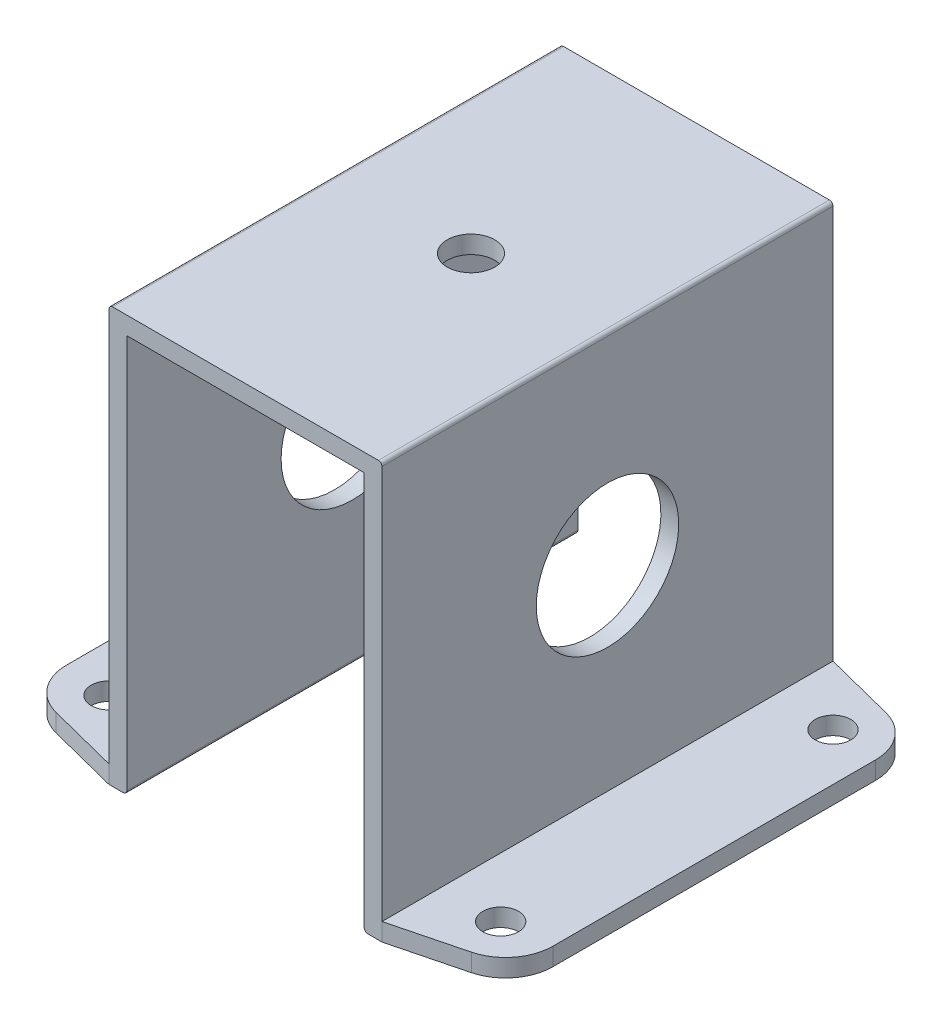
ISO-10303-21;
HEADER;
FILE_DESCRIPTION(('STEP AP214'),'2;1');
FILE_NAME('part.step','',(''),(''),'','','');
FILE_SCHEMA(('AUTOMOTIVE_DESIGN { 1 0 10303 214 1 1 1 1 }'));
ENDSEC;
DATA;
#1=APPLICATION_CONTEXT('core data for automotive mechanical design processes');
#2=APPLICATION_PROTOCOL_DEFINITION('international standard','automotive_design',2000,#1);
#3=PRODUCT_CONTEXT('',#1,'mechanical');
#4=PRODUCT('Part','Part','',(#3));
#5=PRODUCT_RELATED_PRODUCT_CATEGORY('part','',(#4));
#6=PRODUCT_DEFINITION_FORMATION('','',#4);
#7=PRODUCT_DEFINITION_CONTEXT('part definition',#1,'design');
#8=PRODUCT_DEFINITION('design','',#6,#7);
#9=PRODUCT_DEFINITION_SHAPE('','',#8);
#10=(LENGTH_UNIT() NAMED_UNIT(*) SI_UNIT(.MILLI.,.METRE.));
#11=(NAMED_UNIT(*) PLANE_ANGLE_UNIT() SI_UNIT($,.RADIAN.));
#12=(NAMED_UNIT(*) SI_UNIT($,.STERADIAN.) SOLID_ANGLE_UNIT());
#13=UNCERTAINTY_MEASURE_WITH_UNIT(LENGTH_MEASURE(1.E-05),#10,'distance_accuracy_value','');
#14=(GEOMETRIC_REPRESENTATION_CONTEXT(3) GLOBAL_UNCERTAINTY_ASSIGNED_CONTEXT((#13)) GLOBAL_UNIT_ASSIGNED_CONTEXT((#10,
#11,#12)) REPRESENTATION_CONTEXT('',''));
#15=CARTESIAN_POINT('',(0.,0.,0.));
#16=DIRECTION('',(0.,0.,1.));
#17=DIRECTION('',(1.,0.,0.));
#18=AXIS2_PLACEMENT_3D('',#15,#16,#17);
#19=CARTESIAN_POINT('',(-11.5,0.,19.));
#20=DIRECTION('',(0.,1.,0.));
#21=DIRECTION('',(0.,0.,1.));
#22=AXIS2_PLACEMENT_3D('',#19,#20,#21);
#23=PLANE('',#22);
#24=DIRECTION('',(1.,0.,0.));
#25=VECTOR('',#24,1.);
#26=CARTESIAN_POINT('',(-11.5,0.,-19.));
#27=LINE('',#26,#25);
#28=CARTESIAN_POINT('',(-11.5,0.,-19.));
#29=VERTEX_POINT('',#28);
#30=CARTESIAN_POINT('',(-10.3,0.,-19.));
#31=VERTEX_POINT('',#30);
#32=EDGE_CURVE('E316',#29,#31,#27,.T.);
#33=ORIENTED_EDGE('',*,*,#32,.T.);
#34=DIRECTION('',(0.,0.,-1.));
#35=VECTOR('',#34,1.);
#36=CARTESIAN_POINT('',(-10.3,0.,19.));
#37=LINE('',#36,#35);
#38=CARTESIAN_POINT('',(-10.3,0.,19.));
#39=VERTEX_POINT('',#38);
#40=EDGE_CURVE('E369',#31,#39,#37,.F.);
#41=ORIENTED_EDGE('',*,*,#40,.T.);
#42=DIRECTION('',(1.,0.,0.));
#43=VECTOR('',#42,1.);
#44=CARTESIAN_POINT('',(-11.5,0.,19.));
#45=LINE('',#44,#43);
#46=CARTESIAN_POINT('',(-11.5,0.,19.));
#47=VERTEX_POINT('',#46);
#48=EDGE_CURVE('E319',#47,#39,#45,.T.);
#49=ORIENTED_EDGE('',*,*,#48,.F.);
#50=DIRECTION('',(0.968862785912226,0.,0.247598267510903));
#51=VECTOR('',#50,1.);
#52=CARTESIAN_POINT('',(-5.26289257156102,0.,20.5939274539344));
#53=LINE('',#52,#51);
#54=CARTESIAN_POINT('',(-17.4903930700436,0.,17.4691217709889));
#55=VERTEX_POINT('',#54);
#56=EDGE_CURVE('E287',#55,#47,#53,.T.);
#57=ORIENTED_EDGE('',*,*,#56,.F.);
#58=CARTESIAN_POINT('',(-16.5,0.,13.59367062734));
#59=DIRECTION('',(0.,1.,0.));
#60=DIRECTION('',(0.,0.,1.));
#61=AXIS2_PLACEMENT_3D('',#58,#59,#60);
#62=CIRCLE('',#61,4.);
#63=CARTESIAN_POINT('',(-20.5,0.,13.59367062734));
#64=VERTEX_POINT('',#63);
#65=EDGE_CURVE('E284',#55,#64,#62,.F.);
#66=ORIENTED_EDGE('',*,*,#65,.T.);
#67=DIRECTION('',(0.,0.,1.));
#68=VECTOR('',#67,1.);
#69=CARTESIAN_POINT('',(-20.5,0.,0.));
#70=LINE('',#69,#68);
#71=CARTESIAN_POINT('',(-20.5,0.,-13.5936706273399));
#72=VERTEX_POINT('',#71);
#73=EDGE_CURVE('E260',#72,#64,#70,.T.);
#74=ORIENTED_EDGE('',*,*,#73,.F.);
#75=CARTESIAN_POINT('',(-16.5,0.,-13.59367062734));
#76=DIRECTION('',(0.,1.,0.));
#77=DIRECTION('',(0.,0.,1.));
#78=AXIS2_PLACEMENT_3D('',#75,#76,#77);
#79=CIRCLE('',#78,4.);
#80=CARTESIAN_POINT('',(-17.4903930700436,0.,-17.4691217709889));
#81=VERTEX_POINT('',#80);
#82=EDGE_CURVE('E293',#81,#72,#79,.T.);
#83=ORIENTED_EDGE('',*,*,#82,.F.);
#84=DIRECTION('',(-0.968862785912226,0.,0.247598267510902));
#85=VECTOR('',#84,1.);
#86=CARTESIAN_POINT('',(-5.26289257156102,0.,-20.5939274539344));
#87=LINE('',#86,#85);
#88=EDGE_CURVE('E290',#29,#81,#87,.T.);
#89=ORIENTED_EDGE('',*,*,#88,.F.);
#90=EDGE_LOOP('',(#33,#41,#49,#57,#66,#74,#83,#89));
#91=FACE_BOUND('',#90,.T.);
#92=CARTESIAN_POINT('',(-16.5,0.,14.));
#93=DIRECTION('',(0.,1.,0.));
#94=DIRECTION('',(0.,0.,1.));
#95=AXIS2_PLACEMENT_3D('',#92,#93,#94);
#96=CIRCLE('',#95,1.5);
#97=CARTESIAN_POINT('',(-16.5,0.,15.5));
#98=VERTEX_POINT('',#97);
#99=EDGE_CURVE('E201',#98,#98,#96,.T.);
#100=ORIENTED_EDGE('',*,*,#99,.T.);
#101=EDGE_LOOP('',(#100));
#102=FACE_BOUND('',#101,.T.);
#103=CARTESIAN_POINT('',(-16.5,0.,-14.));
#104=DIRECTION('',(0.,1.,0.));
#105=DIRECTION('',(0.,0.,1.));
#106=AXIS2_PLACEMENT_3D('',#103,#104,#105);
#107=CIRCLE('',#106,1.5);
#108=CARTESIAN_POINT('',(-16.5,0.,-12.5));
#109=VERTEX_POINT('',#108);
#110=EDGE_CURVE('E281',#109,#109,#107,.T.);
#111=ORIENTED_EDGE('',*,*,#110,.T.);
#112=EDGE_LOOP('',(#111));
#113=FACE_BOUND('',#112,.T.);
#114=ADVANCED_FACE('F37',(#91,#102,#113),#23,.F.);
#115=CARTESIAN_POINT('',(-10.,0.,19.));
#116=DIRECTION('',(-1.,0.,0.));
#117=DIRECTION('',(0.,0.,1.));
#118=AXIS2_PLACEMENT_3D('',#115,#116,#117);
#119=PLANE('',#118);
#120=CARTESIAN_POINT('',(-10.,18.,0.));
#121=DIRECTION('',(-1.,0.,0.));
#122=DIRECTION('',(0.,0.,1.));
#123=AXIS2_PLACEMENT_3D('',#120,#121,#122);
#124=CIRCLE('',#123,6.);
#125=CARTESIAN_POINT('',(-10.,18.,6.));
#126=VERTEX_POINT('',#125);
#127=EDGE_CURVE('E237',#126,#126,#124,.T.);
#128=ORIENTED_EDGE('',*,*,#127,.T.);
#129=EDGE_LOOP('',(#128));
#130=FACE_BOUND('',#129,.T.);
#131=DIRECTION('',(0.,1.,0.));
#132=VECTOR('',#131,1.);
#133=CARTESIAN_POINT('',(-10.,0.,19.));
#134=LINE('',#133,#132);
#135=CARTESIAN_POINT('',(-10.,0.3,19.));
#136=VERTEX_POINT('',#135);
#137=CARTESIAN_POINT('',(-10.,33.5,19.));
#138=VERTEX_POINT('',#137);
#139=EDGE_CURVE('E322',#136,#138,#134,.T.);
#140=ORIENTED_EDGE('',*,*,#139,.F.);
#141=DIRECTION('',(0.,0.,-1.));
#142=VECTOR('',#141,1.);
#143=CARTESIAN_POINT('',(-10.,0.3,19.));
#144=LINE('',#143,#142);
#145=CARTESIAN_POINT('',(-10.,0.3,-19.));
#146=VERTEX_POINT('',#145);
#147=EDGE_CURVE('E364',#136,#146,#144,.T.);
#148=ORIENTED_EDGE('',*,*,#147,.T.);
#149=DIRECTION('',(0.,1.,0.));
#150=VECTOR('',#149,1.);
#151=CARTESIAN_POINT('',(-10.,0.,-19.));
#152=LINE('',#151,#150);
#153=CARTESIAN_POINT('',(-10.,33.5,-19.));
#154=VERTEX_POINT('',#153);
#155=EDGE_CURVE('E342',#146,#154,#152,.T.);
#156=ORIENTED_EDGE('',*,*,#155,.T.);
#157=DIRECTION('',(0.,0.,-1.));
#158=VECTOR('',#157,1.);
#159=CARTESIAN_POINT('',(-10.,33.5,19.));
#160=LINE('',#159,#158);
#161=EDGE_CURVE('E361',#138,#154,#160,.T.);
#162=ORIENTED_EDGE('',*,*,#161,.F.);
#163=EDGE_LOOP('',(#140,#148,#156,#162));
#164=FACE_BOUND('',#163,.T.);
#165=ADVANCED_FACE('F440',(#130,#164),#119,.F.);
#166=CARTESIAN_POINT('',(-10.,33.5,19.));
#167=DIRECTION('',(0.,1.,0.));
#168=DIRECTION('',(0.,0.,1.));
#169=AXIS2_PLACEMENT_3D('',#166,#167,#168);
#170=PLANE('',#169);
#171=CARTESIAN_POINT('',(0.,33.5,0.));
#172=DIRECTION('',(0.,1.,0.));
#173=DIRECTION('',(0.,0.,1.));
#174=AXIS2_PLACEMENT_3D('',#171,#172,#173);
#175=CIRCLE('',#174,2.);
#176=CARTESIAN_POINT('',(0.,33.5,2.));
#177=VERTEX_POINT('',#176);
#178=EDGE_CURVE('E313',#177,#177,#175,.T.);
#179=ORIENTED_EDGE('',*,*,#178,.T.);
#180=EDGE_LOOP('',(#179));
#181=FACE_BOUND('',#180,.T.);
#182=DIRECTION('',(1.,0.,0.));
#183=VECTOR('',#182,1.);
#184=CARTESIAN_POINT('',(-10.,33.5,-19.));
#185=LINE('',#184,#183);
#186=CARTESIAN_POINT('',(10.,33.5,-19.));
#187=VERTEX_POINT('',#186);
#188=EDGE_CURVE('E344',#154,#187,#185,.T.);
#189=ORIENTED_EDGE('',*,*,#188,.T.);
#190=DIRECTION('',(0.,0.,-1.));
#191=VECTOR('',#190,1.);
#192=CARTESIAN_POINT('',(10.,33.5,19.));
#193=LINE('',#192,#191);
#194=CARTESIAN_POINT('',(10.,33.5,19.));
#195=VERTEX_POINT('',#194);
#196=EDGE_CURVE('E339',#195,#187,#193,.T.);
#197=ORIENTED_EDGE('',*,*,#196,.F.);
#198=DIRECTION('',(1.,0.,0.));
#199=VECTOR('',#198,1.);
#200=CARTESIAN_POINT('',(-10.,33.5,19.));
#201=LINE('',#200,#199);
#202=EDGE_CURVE('E325',#138,#195,#201,.T.);
#203=ORIENTED_EDGE('',*,*,#202,.F.);
#204=ORIENTED_EDGE('',*,*,#161,.T.);
#205=EDGE_LOOP('',(#189,#197,#203,#204));
#206=FACE_BOUND('',#205,.T.);
#207=ADVANCED_FACE('F446',(#181,#206),#170,.F.);
#208=CARTESIAN_POINT('',(10.,33.5,19.));
#209=DIRECTION('',(1.,0.,0.));
#210=DIRECTION('',(0.,1.,0.));
#211=AXIS2_PLACEMENT_3D('',#208,#209,#210);
#212=PLANE('',#211);
#213=CARTESIAN_POINT('',(10.,18.,0.));
#214=DIRECTION('',(1.,0.,0.));
#215=DIRECTION('',(0.,1.,0.));
#216=AXIS2_PLACEMENT_3D('',#213,#214,#215);
#217=CIRCLE('',#216,6.);
#218=CARTESIAN_POINT('',(10.,24.,0.));
#219=VERTEX_POINT('',#218);
#220=EDGE_CURVE('E754',#219,#219,#217,.T.);
#221=ORIENTED_EDGE('',*,*,#220,.T.);
#222=EDGE_LOOP('',(#221));
#223=FACE_BOUND('',#222,.T.);
#224=DIRECTION('',(0.,-1.,0.));
#225=VECTOR('',#224,1.);
#226=CARTESIAN_POINT('',(10.,33.5,-19.));
#227=LINE('',#226,#225);
#228=CARTESIAN_POINT('',(10.,0.300000000000002,-19.));
#229=VERTEX_POINT('',#228);
#230=EDGE_CURVE('E346',#187,#229,#227,.T.);
#231=ORIENTED_EDGE('',*,*,#230,.T.);
#232=DIRECTION('',(0.,0.,-1.));
#233=VECTOR('',#232,1.);
#234=CARTESIAN_POINT('',(10.,0.300000000000002,19.));
#235=LINE('',#234,#233);
#236=CARTESIAN_POINT('',(10.,0.300000000000002,19.));
#237=VERTEX_POINT('',#236);
#238=EDGE_CURVE('E378',#229,#237,#235,.F.);
#239=ORIENTED_EDGE('',*,*,#238,.T.);
#240=DIRECTION('',(0.,-1.,0.));
#241=VECTOR('',#240,1.);
#242=CARTESIAN_POINT('',(10.,33.5,19.));
#243=LINE('',#242,#241);
#244=EDGE_CURVE('E327',#195,#237,#243,.T.);
#245=ORIENTED_EDGE('',*,*,#244,.F.);
#246=ORIENTED_EDGE('',*,*,#196,.T.);
#247=EDGE_LOOP('',(#231,#239,#245,#246));
#248=FACE_BOUND('',#247,.T.);
#249=ADVANCED_FACE('F539',(#223,#248),#212,.F.);
#250=CARTESIAN_POINT('',(10.,0.,19.));
#251=DIRECTION('',(0.,1.,0.));
#252=DIRECTION('',(0.,0.,1.));
#253=AXIS2_PLACEMENT_3D('',#250,#251,#252);
#254=PLANE('',#253);
#255=DIRECTION('',(1.,0.,0.));
#256=VECTOR('',#255,1.);
#257=CARTESIAN_POINT('',(10.,0.,19.));
#258=LINE('',#257,#256);
#259=CARTESIAN_POINT('',(10.3,0.,19.));
#260=VERTEX_POINT('',#259);
#261=CARTESIAN_POINT('',(11.5,0.,19.));
#262=VERTEX_POINT('',#261);
#263=EDGE_CURVE('E330',#260,#262,#258,.T.);
#264=ORIENTED_EDGE('',*,*,#263,.F.);
#265=DIRECTION('',(0.,0.,-1.));
#266=VECTOR('',#265,1.);
#267=CARTESIAN_POINT('',(10.3,0.,19.));
#268=LINE('',#267,#266);
#269=CARTESIAN_POINT('',(10.3,0.,-19.));
#270=VERTEX_POINT('',#269);
#271=EDGE_CURVE('E373',#260,#270,#268,.T.);
#272=ORIENTED_EDGE('',*,*,#271,.T.);
#273=DIRECTION('',(1.,0.,0.));
#274=VECTOR('',#273,1.);
#275=CARTESIAN_POINT('',(10.,0.,-19.));
#276=LINE('',#275,#274);
#277=CARTESIAN_POINT('',(11.5,0.,-19.));
#278=VERTEX_POINT('',#277);
#279=EDGE_CURVE('E349',#270,#278,#276,.T.);
#280=ORIENTED_EDGE('',*,*,#279,.T.);
#281=DIRECTION('',(0.968862785912226,0.,0.247598267510902));
#282=VECTOR('',#281,1.);
#283=CARTESIAN_POINT('',(5.26289257156102,0.,-20.5939274539344));
#284=LINE('',#283,#282);
#285=CARTESIAN_POINT('',(17.4903930700436,0.,-17.4691217709889));
#286=VERTEX_POINT('',#285);
#287=EDGE_CURVE('E247',#278,#286,#284,.T.);
#288=ORIENTED_EDGE('',*,*,#287,.T.);
#289=CARTESIAN_POINT('',(16.5,0.,-13.5936706273399));
#290=DIRECTION('',(0.,1.,0.));
#291=DIRECTION('',(0.,0.,1.));
#292=AXIS2_PLACEMENT_3D('',#289,#290,#291);
#293=CIRCLE('',#292,4.);
#294=CARTESIAN_POINT('',(20.5,0.,-13.5936706273399));
#295=VERTEX_POINT('',#294);
#296=EDGE_CURVE('E244',#295,#286,#293,.T.);
#297=ORIENTED_EDGE('',*,*,#296,.F.);
#298=DIRECTION('',(0.,0.,1.));
#299=VECTOR('',#298,1.);
#300=CARTESIAN_POINT('',(20.5,0.,0.));
#301=LINE('',#300,#299);
#302=CARTESIAN_POINT('',(20.5,0.,13.5936706273399));
#303=VERTEX_POINT('',#302);
#304=EDGE_CURVE('E241',#295,#303,#301,.T.);
#305=ORIENTED_EDGE('',*,*,#304,.T.);
#306=CARTESIAN_POINT('',(16.5,0.,13.59367062734));
#307=DIRECTION('',(0.,1.,0.));
#308=DIRECTION('',(0.,0.,1.));
#309=AXIS2_PLACEMENT_3D('',#306,#307,#308);
#310=CIRCLE('',#309,4.);
#311=CARTESIAN_POINT('',(17.4903930700436,0.,17.4691217709889));
#312=VERTEX_POINT('',#311);
#313=EDGE_CURVE('E239',#312,#303,#310,.T.);
#314=ORIENTED_EDGE('',*,*,#313,.F.);
#315=DIRECTION('',(-0.968862785912226,0.,0.247598267510902));
#316=VECTOR('',#315,1.);
#317=CARTESIAN_POINT('',(5.26289257156102,0.,20.5939274539344));
#318=LINE('',#317,#316);
#319=EDGE_CURVE('E197',#312,#262,#318,.T.);
#320=ORIENTED_EDGE('',*,*,#319,.T.);
#321=EDGE_LOOP('',(#264,#272,#280,#288,#297,#305,#314,#320));
#322=FACE_BOUND('',#321,.T.);
#323=CARTESIAN_POINT('',(16.5,0.,14.));
#324=DIRECTION('',(0.,1.,0.));
#325=DIRECTION('',(0.,0.,1.));
#326=AXIS2_PLACEMENT_3D('',#323,#324,#325);
#327=CIRCLE('',#326,1.5);
#328=CARTESIAN_POINT('',(16.5,0.,15.5));
#329=VERTEX_POINT('',#328);
#330=EDGE_CURVE('E234',#329,#329,#327,.F.);
#331=ORIENTED_EDGE('',*,*,#330,.F.);
#332=EDGE_LOOP('',(#331));
#333=FACE_BOUND('',#332,.T.);
#334=CARTESIAN_POINT('',(16.5,0.,-14.));
#335=DIRECTION('',(0.,1.,0.));
#336=DIRECTION('',(0.,0.,1.));
#337=AXIS2_PLACEMENT_3D('',#334,#335,#336);
#338=CIRCLE('',#337,1.5);
#339=CARTESIAN_POINT('',(16.5,0.,-12.5));
#340=VERTEX_POINT('',#339);
#341=EDGE_CURVE('E219',#340,#340,#338,.F.);
#342=ORIENTED_EDGE('',*,*,#341,.F.);
#343=EDGE_LOOP('',(#342));
#344=FACE_BOUND('',#343,.T.);
#345=ADVANCED_FACE('F457',(#322,#333,#344),#254,.F.);
#346=CARTESIAN_POINT('',(11.5,0.,19.));
#347=DIRECTION('',(-1.,0.,0.));
#348=DIRECTION('',(0.,0.,1.));
#349=AXIS2_PLACEMENT_3D('',#346,#347,#348);
#350=PLANE('',#349);
#351=CARTESIAN_POINT('',(11.5,18.,0.));
#352=DIRECTION('',(-1.,0.,0.));
#353=DIRECTION('',(0.,0.,1.));
#354=AXIS2_PLACEMENT_3D('',#351,#352,#353);
#355=CIRCLE('',#354,6.);
#356=CARTESIAN_POINT('',(11.5,18.,6.));
#357=VERTEX_POINT('',#356);
#358=EDGE_CURVE('E751',#357,#357,#355,.T.);
#359=ORIENTED_EDGE('',*,*,#358,.T.);
#360=EDGE_LOOP('',(#359));
#361=FACE_BOUND('',#360,.T.);
#362=DIRECTION('',(0.,1.,0.));
#363=VECTOR('',#362,1.);
#364=CARTESIAN_POINT('',(11.5,0.,19.));
#365=LINE('',#364,#363);
#366=CARTESIAN_POINT('',(11.5,1.5,19.));
#367=VERTEX_POINT('',#366);
#368=CARTESIAN_POINT('',(11.5,34.7,19.));
#369=VERTEX_POINT('',#368);
#370=EDGE_CURVE('E52',#367,#369,#365,.T.);
#371=ORIENTED_EDGE('',*,*,#370,.F.);
#372=DIRECTION('',(0.,0.,-1.));
#373=VECTOR('',#372,1.);
#374=CARTESIAN_POINT('',(11.5,1.5,0.));
#375=LINE('',#374,#373);
#376=CARTESIAN_POINT('',(11.5,1.5,-19.));
#377=VERTEX_POINT('',#376);
#378=EDGE_CURVE('E215',#367,#377,#375,.T.);
#379=ORIENTED_EDGE('',*,*,#378,.T.);
#380=DIRECTION('',(0.,1.,0.));
#381=VECTOR('',#380,1.);
#382=CARTESIAN_POINT('',(11.5,0.,-19.));
#383=LINE('',#382,#381);
#384=CARTESIAN_POINT('',(11.5,34.7,-19.));
#385=VERTEX_POINT('',#384);
#386=EDGE_CURVE('E351',#377,#385,#383,.T.);
#387=ORIENTED_EDGE('',*,*,#386,.T.);
#388=DIRECTION('',(0.,0.,-1.));
#389=VECTOR('',#388,1.);
#390=CARTESIAN_POINT('',(11.5,34.7,19.));
#391=LINE('',#390,#389);
#392=EDGE_CURVE('E392',#385,#369,#391,.F.);
#393=ORIENTED_EDGE('',*,*,#392,.T.);
#394=EDGE_LOOP('',(#371,#379,#387,#393));
#395=FACE_BOUND('',#394,.T.);
#396=ADVANCED_FACE('F532',(#361,#395),#350,.F.);
#397=CARTESIAN_POINT('',(11.5,35.,19.));
#398=DIRECTION('',(0.,-1.,0.));
#399=DIRECTION('',(0.,0.,-1.));
#400=AXIS2_PLACEMENT_3D('',#397,#398,#399);
#401=PLANE('',#400);
#402=CARTESIAN_POINT('',(0.,35.,0.));
#403=DIRECTION('',(0.,1.,0.));
#404=DIRECTION('',(0.,0.,1.));
#405=AXIS2_PLACEMENT_3D('',#402,#403,#404);
#406=CIRCLE('',#405,2.);
#407=CARTESIAN_POINT('',(0.,35.,2.));
#408=VERTEX_POINT('',#407);
#409=EDGE_CURVE('E312',#408,#408,#406,.T.);
#410=ORIENTED_EDGE('',*,*,#409,.F.);
#411=EDGE_LOOP('',(#410));
#412=FACE_BOUND('',#411,.T.);
#413=DIRECTION('',(-1.,0.,0.));
#414=VECTOR('',#413,1.);
#415=CARTESIAN_POINT('',(11.5,35.,19.));
#416=LINE('',#415,#414);
#417=CARTESIAN_POINT('',(11.2,35.,19.));
#418=VERTEX_POINT('',#417);
#419=CARTESIAN_POINT('',(-11.2,35.,19.));
#420=VERTEX_POINT('',#419);
#421=EDGE_CURVE('E334',#418,#420,#416,.T.);
#422=ORIENTED_EDGE('',*,*,#421,.F.);
#423=DIRECTION('',(0.,0.,-1.));
#424=VECTOR('',#423,1.);
#425=CARTESIAN_POINT('',(11.2,35.,19.));
#426=LINE('',#425,#424);
#427=CARTESIAN_POINT('',(11.2,35.,-19.));
#428=VERTEX_POINT('',#427);
#429=EDGE_CURVE('E384',#418,#428,#426,.T.);
#430=ORIENTED_EDGE('',*,*,#429,.T.);
#431=DIRECTION('',(-1.,0.,0.));
#432=VECTOR('',#431,1.);
#433=CARTESIAN_POINT('',(11.5,35.,-19.));
#434=LINE('',#433,#432);
#435=CARTESIAN_POINT('',(-11.2,35.,-19.));
#436=VERTEX_POINT('',#435);
#437=EDGE_CURVE('E355',#428,#436,#434,.T.);
#438=ORIENTED_EDGE('',*,*,#437,.T.);
#439=DIRECTION('',(0.,0.,-1.));
#440=VECTOR('',#439,1.);
#441=CARTESIAN_POINT('',(-11.2,35.,19.));
#442=LINE('',#441,#440);
#443=EDGE_CURVE('E382',#436,#420,#442,.F.);
#444=ORIENTED_EDGE('',*,*,#443,.T.);
#445=EDGE_LOOP('',(#422,#430,#438,#444));
#446=FACE_BOUND('',#445,.T.);
#447=ADVANCED_FACE('F404',(#412,#446),#401,.F.);
#448=CARTESIAN_POINT('',(-11.5,35.,19.));
#449=DIRECTION('',(1.,0.,0.));
#450=DIRECTION('',(0.,1.,0.));
#451=AXIS2_PLACEMENT_3D('',#448,#449,#450);
#452=PLANE('',#451);
#453=CARTESIAN_POINT('',(-11.5,18.,0.));
#454=DIRECTION('',(-1.,0.,0.));
#455=DIRECTION('',(0.,-1.,0.));
#456=AXIS2_PLACEMENT_3D('',#453,#454,#455);
#457=CIRCLE('',#456,6.);
#458=CARTESIAN_POINT('',(-11.5,12.,0.));
#459=VERTEX_POINT('',#458);
#460=EDGE_CURVE('E757',#459,#459,#457,.T.);
#461=ORIENTED_EDGE('',*,*,#460,.F.);
#462=EDGE_LOOP('',(#461));
#463=FACE_BOUND('',#462,.T.);
#464=DIRECTION('',(0.,-1.,0.));
#465=VECTOR('',#464,1.);
#466=CARTESIAN_POINT('',(-11.5,35.,-19.));
#467=LINE('',#466,#465);
#468=CARTESIAN_POINT('',(-11.5,34.7,-19.));
#469=VERTEX_POINT('',#468);
#470=CARTESIAN_POINT('',(-11.5,1.5,-19.));
#471=VERTEX_POINT('',#470);
#472=EDGE_CURVE('E323',#469,#471,#467,.T.);
#473=ORIENTED_EDGE('',*,*,#472,.T.);
#474=DIRECTION('',(0.,0.,-1.));
#475=VECTOR('',#474,1.);
#476=CARTESIAN_POINT('',(-11.5,1.5,0.));
#477=LINE('',#476,#475);
#478=CARTESIAN_POINT('',(-11.5,1.5,19.));
#479=VERTEX_POINT('',#478);
#480=EDGE_CURVE('E60',#479,#471,#477,.T.);
#481=ORIENTED_EDGE('',*,*,#480,.F.);
#482=DIRECTION('',(0.,-1.,0.));
#483=VECTOR('',#482,1.);
#484=CARTESIAN_POINT('',(-11.5,35.,19.));
#485=LINE('',#484,#483);
#486=CARTESIAN_POINT('',(-11.5,34.7,19.));
#487=VERTEX_POINT('',#486);
#488=EDGE_CURVE('E337',#487,#479,#485,.T.);
#489=ORIENTED_EDGE('',*,*,#488,.F.);
#490=DIRECTION('',(0.,0.,-1.));
#491=VECTOR('',#490,1.);
#492=CARTESIAN_POINT('',(-11.5,34.7,19.));
#493=LINE('',#492,#491);
#494=EDGE_CURVE('E11',#487,#469,#493,.T.);
#495=ORIENTED_EDGE('',*,*,#494,.T.);
#496=EDGE_LOOP('',(#473,#481,#489,#495));
#497=FACE_BOUND('',#496,.T.);
#498=ADVANCED_FACE('F414',(#463,#497),#452,.F.);
#499=CARTESIAN_POINT('',(0.,0.,19.));
#500=DIRECTION('',(0.,0.,1.));
#501=DIRECTION('',(1.,0.,0.));
#502=AXIS2_PLACEMENT_3D('',#499,#500,#501);
#503=PLANE('',#502);
#504=EDGE_CURVE('E332',#262,#367,#365,.T.);
#505=ORIENTED_EDGE('',*,*,#504,.T.);
#506=ORIENTED_EDGE('',*,*,#370,.T.);
#507=CARTESIAN_POINT('',(11.2,34.7,19.));
#508=DIRECTION('',(0.,0.,1.));
#509=DIRECTION('',(1.,0.,0.));
#510=AXIS2_PLACEMENT_3D('',#507,#508,#509);
#511=CIRCLE('',#510,0.3);
#512=EDGE_CURVE('E45',#369,#418,#511,.T.);
#513=ORIENTED_EDGE('',*,*,#512,.T.);
#514=ORIENTED_EDGE('',*,*,#421,.T.);
#515=CARTESIAN_POINT('',(-11.2,34.7,19.));
#516=DIRECTION('',(0.,0.,1.));
#517=DIRECTION('',(1.,0.,0.));
#518=AXIS2_PLACEMENT_3D('',#515,#516,#517);
#519=CIRCLE('',#518,0.3);
#520=EDGE_CURVE('E394',#420,#487,#519,.T.);
#521=ORIENTED_EDGE('',*,*,#520,.T.);
#522=ORIENTED_EDGE('',*,*,#488,.T.);
#523=DIRECTION('',(0.,-1.,0.));
#524=VECTOR('',#523,1.);
#525=CARTESIAN_POINT('',(-11.5,1.5,19.));
#526=LINE('',#525,#524);
#527=EDGE_CURVE('E308',#479,#47,#526,.T.);
#528=ORIENTED_EDGE('',*,*,#527,.T.);
#529=ORIENTED_EDGE('',*,*,#48,.T.);
#530=CARTESIAN_POINT('',(-10.3,0.3,19.));
#531=DIRECTION('',(0.,0.,1.));
#532=DIRECTION('',(1.,0.,0.));
#533=AXIS2_PLACEMENT_3D('',#530,#531,#532);
#534=CIRCLE('',#533,0.3);
#535=EDGE_CURVE('E371',#39,#136,#534,.T.);
#536=ORIENTED_EDGE('',*,*,#535,.T.);
#537=ORIENTED_EDGE('',*,*,#139,.T.);
#538=ORIENTED_EDGE('',*,*,#202,.T.);
#539=ORIENTED_EDGE('',*,*,#244,.T.);
#540=CARTESIAN_POINT('',(10.3,0.3,19.));
#541=DIRECTION('',(0.,0.,1.));
#542=DIRECTION('',(1.,0.,0.));
#543=AXIS2_PLACEMENT_3D('',#540,#541,#542);
#544=CIRCLE('',#543,0.3);
#545=EDGE_CURVE('E380',#237,#260,#544,.T.);
#546=ORIENTED_EDGE('',*,*,#545,.T.);
#547=ORIENTED_EDGE('',*,*,#263,.T.);
#548=EDGE_LOOP('',(#505,#506,#513,#514,#521,#522,#528,#529,#536,#537,#538,#539,#546,#547));
#549=FACE_BOUND('',#548,.T.);
#550=ADVANCED_FACE('F398',(#549),#503,.T.);
#551=CARTESIAN_POINT('',(0.,0.,-19.));
#552=DIRECTION('',(0.,0.,1.));
#553=DIRECTION('',(1.,0.,0.));
#554=AXIS2_PLACEMENT_3D('',#551,#552,#553);
#555=PLANE('',#554);
#556=ORIENTED_EDGE('',*,*,#437,.F.);
#557=CARTESIAN_POINT('',(11.2,34.7,-19.));
#558=DIRECTION('',(0.,0.,1.));
#559=DIRECTION('',(1.,0.,0.));
#560=AXIS2_PLACEMENT_3D('',#557,#558,#559);
#561=CIRCLE('',#560,0.3);
#562=EDGE_CURVE('E389',#428,#385,#561,.F.);
#563=ORIENTED_EDGE('',*,*,#562,.T.);
#564=ORIENTED_EDGE('',*,*,#386,.F.);
#565=EDGE_CURVE('E352',#278,#377,#383,.T.);
#566=ORIENTED_EDGE('',*,*,#565,.F.);
#567=ORIENTED_EDGE('',*,*,#279,.F.);
#568=CARTESIAN_POINT('',(10.3,0.3,-19.));
#569=DIRECTION('',(0.,0.,1.));
#570=DIRECTION('',(1.,0.,0.));
#571=AXIS2_PLACEMENT_3D('',#568,#569,#570);
#572=CIRCLE('',#571,0.3);
#573=EDGE_CURVE('E376',#270,#229,#572,.F.);
#574=ORIENTED_EDGE('',*,*,#573,.T.);
#575=ORIENTED_EDGE('',*,*,#230,.F.);
#576=ORIENTED_EDGE('',*,*,#188,.F.);
#577=ORIENTED_EDGE('',*,*,#155,.F.);
#578=CARTESIAN_POINT('',(-10.3,0.3,-19.));
#579=DIRECTION('',(0.,0.,1.));
#580=DIRECTION('',(1.,0.,0.));
#581=AXIS2_PLACEMENT_3D('',#578,#579,#580);
#582=CIRCLE('',#581,0.3);
#583=EDGE_CURVE('E367',#146,#31,#582,.F.);
#584=ORIENTED_EDGE('',*,*,#583,.T.);
#585=ORIENTED_EDGE('',*,*,#32,.F.);
#586=DIRECTION('',(0.,-1.,0.));
#587=VECTOR('',#586,1.);
#588=CARTESIAN_POINT('',(-11.5,1.5,-19.));
#589=LINE('',#588,#587);
#590=EDGE_CURVE('E305',#471,#29,#589,.T.);
#591=ORIENTED_EDGE('',*,*,#590,.F.);
#592=ORIENTED_EDGE('',*,*,#472,.F.);
#593=CARTESIAN_POINT('',(-11.2,34.7,-19.));
#594=DIRECTION('',(0.,0.,1.));
#595=DIRECTION('',(1.,0.,0.));
#596=AXIS2_PLACEMENT_3D('',#593,#594,#595);
#597=CIRCLE('',#596,0.3);
#598=EDGE_CURVE('E387',#469,#436,#597,.F.);
#599=ORIENTED_EDGE('',*,*,#598,.T.);
#600=EDGE_LOOP('',(#556,#563,#564,#566,#567,#574,#575,#576,#577,#584,#585,#591,#592,#599));
#601=FACE_BOUND('',#600,.T.);
#602=ADVANCED_FACE('F409',(#601),#555,.F.);
#603=CARTESIAN_POINT('',(0.,33.5,0.));
#604=DIRECTION('',(0.,1.,0.));
#605=DIRECTION('',(0.,0.,1.));
#606=AXIS2_PLACEMENT_3D('',#603,#604,#605);
#607=CYLINDRICAL_SURFACE('',#606,2.);
#608=ORIENTED_EDGE('',*,*,#178,.F.);
#609=EDGE_LOOP('',(#608));
#610=FACE_BOUND('',#609,.T.);
#611=ORIENTED_EDGE('',*,*,#409,.T.);
#612=EDGE_LOOP('',(#611));
#613=FACE_BOUND('',#612,.T.);
#614=ADVANCED_FACE('F492',(#610,#613),#607,.F.);
#615=CARTESIAN_POINT('',(-10.3,0.3,19.));
#616=DIRECTION('',(0.,0.,-1.));
#617=DIRECTION('',(-1.,0.,0.));
#618=AXIS2_PLACEMENT_3D('',#615,#616,#617);
#619=CYLINDRICAL_SURFACE('',#618,0.3);
#620=ORIENTED_EDGE('',*,*,#535,.F.);
#621=ORIENTED_EDGE('',*,*,#40,.F.);
#622=ORIENTED_EDGE('',*,*,#583,.F.);
#623=ORIENTED_EDGE('',*,*,#147,.F.);
#624=EDGE_LOOP('',(#620,#621,#622,#623));
#625=FACE_BOUND('',#624,.T.);
#626=ADVANCED_FACE('F435',(#625),#619,.T.);
#627=CARTESIAN_POINT('',(10.3,0.3,19.));
#628=DIRECTION('',(0.,0.,-1.));
#629=DIRECTION('',(-1.,0.,0.));
#630=AXIS2_PLACEMENT_3D('',#627,#628,#629);
#631=CYLINDRICAL_SURFACE('',#630,0.3);
#632=ORIENTED_EDGE('',*,*,#545,.F.);
#633=ORIENTED_EDGE('',*,*,#238,.F.);
#634=ORIENTED_EDGE('',*,*,#573,.F.);
#635=ORIENTED_EDGE('',*,*,#271,.F.);
#636=EDGE_LOOP('',(#632,#633,#634,#635));
#637=FACE_BOUND('',#636,.T.);
#638=ADVANCED_FACE('F454',(#637),#631,.T.);
#639=CARTESIAN_POINT('',(11.2,34.7,19.));
#640=DIRECTION('',(0.,0.,-1.));
#641=DIRECTION('',(-1.,0.,0.));
#642=AXIS2_PLACEMENT_3D('',#639,#640,#641);
#643=CYLINDRICAL_SURFACE('',#642,0.3);
#644=ORIENTED_EDGE('',*,*,#512,.F.);
#645=ORIENTED_EDGE('',*,*,#392,.F.);
#646=ORIENTED_EDGE('',*,*,#562,.F.);
#647=ORIENTED_EDGE('',*,*,#429,.F.);
#648=EDGE_LOOP('',(#644,#645,#646,#647));
#649=FACE_BOUND('',#648,.T.);
#650=ADVANCED_FACE('F407',(#649),#643,.T.);
#651=CARTESIAN_POINT('',(-11.2,34.7,19.));
#652=DIRECTION('',(0.,0.,-1.));
#653=DIRECTION('',(-1.,0.,0.));
#654=AXIS2_PLACEMENT_3D('',#651,#652,#653);
#655=CYLINDRICAL_SURFACE('',#654,0.3);
#656=ORIENTED_EDGE('',*,*,#520,.F.);
#657=ORIENTED_EDGE('',*,*,#443,.F.);
#658=ORIENTED_EDGE('',*,*,#598,.F.);
#659=ORIENTED_EDGE('',*,*,#494,.F.);
#660=EDGE_LOOP('',(#656,#657,#658,#659));
#661=FACE_BOUND('',#660,.T.);
#662=ADVANCED_FACE('F39',(#661),#655,.T.);
#663=CARTESIAN_POINT('',(-16.5,1.5,13.59367062734));
#664=DIRECTION('',(0.,-1.,0.));
#665=DIRECTION('',(0.,0.,-1.));
#666=AXIS2_PLACEMENT_3D('',#663,#664,#665);
#667=CYLINDRICAL_SURFACE('',#666,4.);
#668=ORIENTED_EDGE('',*,*,#65,.F.);
#669=DIRECTION('',(0.,-1.,0.));
#670=VECTOR('',#669,1.);
#671=CARTESIAN_POINT('',(-17.4903930700436,1.5,17.4691217709889));
#672=LINE('',#671,#670);
#673=CARTESIAN_POINT('',(-17.4903930700436,1.5,17.4691217709889));
#674=VERTEX_POINT('',#673);
#675=EDGE_CURVE('E310',#674,#55,#672,.T.);
#676=ORIENTED_EDGE('',*,*,#675,.F.);
#677=CARTESIAN_POINT('',(-16.5,1.5,13.59367062734));
#678=DIRECTION('',(0.,1.,0.));
#679=DIRECTION('',(0.,0.,1.));
#680=AXIS2_PLACEMENT_3D('',#677,#678,#679);
#681=CIRCLE('',#680,4.);
#682=CARTESIAN_POINT('',(-20.5,1.5,13.59367062734));
#683=VERTEX_POINT('',#682);
#684=EDGE_CURVE('E263',#674,#683,#681,.F.);
#685=ORIENTED_EDGE('',*,*,#684,.T.);
#686=DIRECTION('',(0.,-1.,0.));
#687=VECTOR('',#686,1.);
#688=CARTESIAN_POINT('',(-20.5,1.5,13.59367062734));
#689=LINE('',#688,#687);
#690=EDGE_CURVE('E278',#683,#64,#689,.T.);
#691=ORIENTED_EDGE('',*,*,#690,.T.);
#692=EDGE_LOOP('',(#668,#676,#685,#691));
#693=FACE_BOUND('',#692,.T.);
#694=ADVANCED_FACE('F498',(#693),#667,.T.);
#695=CARTESIAN_POINT('',(-5.26289257156102,1.5,20.5939274539344));
#696=DIRECTION('',(0.247598267510902,0.,-0.968862785912226));
#697=DIRECTION('',(-0.968862785912226,0.,-0.247598267510903));
#698=AXIS2_PLACEMENT_3D('',#695,#696,#697);
#699=PLANE('',#698);
#700=ORIENTED_EDGE('',*,*,#56,.T.);
#701=ORIENTED_EDGE('',*,*,#527,.F.);
#702=DIRECTION('',(0.968862785912226,0.,0.247598267510903));
#703=VECTOR('',#702,1.);
#704=CARTESIAN_POINT('',(-5.26289257156102,1.5,20.5939274539344));
#705=LINE('',#704,#703);
#706=EDGE_CURVE('E266',#674,#479,#705,.T.);
#707=ORIENTED_EDGE('',*,*,#706,.F.);
#708=ORIENTED_EDGE('',*,*,#675,.T.);
#709=EDGE_LOOP('',(#700,#701,#707,#708));
#710=FACE_BOUND('',#709,.T.);
#711=ADVANCED_FACE('F426',(#710),#699,.F.);
#712=CARTESIAN_POINT('',(-5.26289257156102,1.5,-20.5939274539344));
#713=DIRECTION('',(0.247598267510902,0.,0.968862785912226));
#714=DIRECTION('',(0.968862785912226,0.,-0.247598267510902));
#715=AXIS2_PLACEMENT_3D('',#712,#713,#714);
#716=PLANE('',#715);
#717=ORIENTED_EDGE('',*,*,#88,.T.);
#718=DIRECTION('',(0.,-1.,0.));
#719=VECTOR('',#718,1.);
#720=CARTESIAN_POINT('',(-17.4903930700436,1.5,-17.4691217709889));
#721=LINE('',#720,#719);
#722=CARTESIAN_POINT('',(-17.4903930700436,1.5,-17.4691217709889));
#723=VERTEX_POINT('',#722);
#724=EDGE_CURVE('E302',#723,#81,#721,.T.);
#725=ORIENTED_EDGE('',*,*,#724,.F.);
#726=DIRECTION('',(-0.968862785912226,0.,0.247598267510902));
#727=VECTOR('',#726,1.);
#728=CARTESIAN_POINT('',(-5.26289257156102,1.5,-20.5939274539344));
#729=LINE('',#728,#727);
#730=EDGE_CURVE('E270',#471,#723,#729,.T.);
#731=ORIENTED_EDGE('',*,*,#730,.F.);
#732=ORIENTED_EDGE('',*,*,#590,.T.);
#733=EDGE_LOOP('',(#717,#725,#731,#732));
#734=FACE_BOUND('',#733,.T.);
#735=ADVANCED_FACE('F418',(#734),#716,.F.);
#736=CARTESIAN_POINT('',(-16.5,1.5,-13.59367062734));
#737=DIRECTION('',(0.,-1.,0.));
#738=DIRECTION('',(0.,0.,-1.));
#739=AXIS2_PLACEMENT_3D('',#736,#737,#738);
#740=CYLINDRICAL_SURFACE('',#739,4.);
#741=ORIENTED_EDGE('',*,*,#82,.T.);
#742=DIRECTION('',(0.,-1.,0.));
#743=VECTOR('',#742,1.);
#744=CARTESIAN_POINT('',(-20.5,1.5,-13.5936706273399));
#745=LINE('',#744,#743);
#746=CARTESIAN_POINT('',(-20.5,1.5,-13.5936706273399));
#747=VERTEX_POINT('',#746);
#748=EDGE_CURVE('E299',#747,#72,#745,.T.);
#749=ORIENTED_EDGE('',*,*,#748,.F.);
#750=CARTESIAN_POINT('',(-16.5,1.5,-13.59367062734));
#751=DIRECTION('',(0.,1.,0.));
#752=DIRECTION('',(0.,0.,1.));
#753=AXIS2_PLACEMENT_3D('',#750,#751,#752);
#754=CIRCLE('',#753,4.);
#755=EDGE_CURVE('E273',#723,#747,#754,.T.);
#756=ORIENTED_EDGE('',*,*,#755,.F.);
#757=ORIENTED_EDGE('',*,*,#724,.T.);
#758=EDGE_LOOP('',(#741,#749,#756,#757));
#759=FACE_BOUND('',#758,.T.);
#760=ADVANCED_FACE('F514',(#759),#740,.T.);
#761=CARTESIAN_POINT('',(-16.5,1.5,-14.));
#762=DIRECTION('',(0.,-1.,0.));
#763=DIRECTION('',(0.,0.,-1.));
#764=AXIS2_PLACEMENT_3D('',#761,#762,#763);
#765=CYLINDRICAL_SURFACE('',#764,1.5);
#766=CARTESIAN_POINT('',(-16.5,1.5,-14.));
#767=DIRECTION('',(0.,1.,0.));
#768=DIRECTION('',(0.,0.,1.));
#769=AXIS2_PLACEMENT_3D('',#766,#767,#768);
#770=CIRCLE('',#769,1.5);
#771=CARTESIAN_POINT('',(-16.5,1.5,-12.5));
#772=VERTEX_POINT('',#771);
#773=EDGE_CURVE('E259',#772,#772,#770,.T.);
#774=ORIENTED_EDGE('',*,*,#773,.T.);
#775=EDGE_LOOP('',(#774));
#776=FACE_BOUND('',#775,.T.);
#777=ORIENTED_EDGE('',*,*,#110,.F.);
#778=EDGE_LOOP('',(#777));
#779=FACE_BOUND('',#778,.T.);
#780=ADVANCED_FACE('F510',(#776,#779),#765,.F.);
#781=CARTESIAN_POINT('',(-16.5,1.5,14.));
#782=DIRECTION('',(0.,-1.,0.));
#783=DIRECTION('',(0.,0.,-1.));
#784=AXIS2_PLACEMENT_3D('',#781,#782,#783);
#785=CYLINDRICAL_SURFACE('',#784,1.5);
#786=CARTESIAN_POINT('',(-16.5,1.5,14.));
#787=DIRECTION('',(0.,1.,0.));
#788=DIRECTION('',(0.,0.,1.));
#789=AXIS2_PLACEMENT_3D('',#786,#787,#788);
#790=CIRCLE('',#789,1.5);
#791=CARTESIAN_POINT('',(-16.5,1.5,15.5));
#792=VERTEX_POINT('',#791);
#793=EDGE_CURVE('E256',#792,#792,#790,.T.);
#794=ORIENTED_EDGE('',*,*,#793,.T.);
#795=EDGE_LOOP('',(#794));
#796=FACE_BOUND('',#795,.T.);
#797=ORIENTED_EDGE('',*,*,#99,.F.);
#798=EDGE_LOOP('',(#797));
#799=FACE_BOUND('',#798,.T.);
#800=ADVANCED_FACE('F513',(#796,#799),#785,.F.);
#801=CARTESIAN_POINT('',(-20.5,1.5,0.));
#802=DIRECTION('',(1.,0.,0.));
#803=DIRECTION('',(0.,0.,-1.));
#804=AXIS2_PLACEMENT_3D('',#801,#802,#803);
#805=PLANE('',#804);
#806=ORIENTED_EDGE('',*,*,#73,.T.);
#807=ORIENTED_EDGE('',*,*,#690,.F.);
#808=DIRECTION('',(0.,0.,1.));
#809=VECTOR('',#808,1.);
#810=CARTESIAN_POINT('',(-20.5,1.5,0.));
#811=LINE('',#810,#809);
#812=EDGE_CURVE('E276',#747,#683,#811,.T.);
#813=ORIENTED_EDGE('',*,*,#812,.F.);
#814=ORIENTED_EDGE('',*,*,#748,.T.);
#815=EDGE_LOOP('',(#806,#807,#813,#814));
#816=FACE_BOUND('',#815,.T.);
#817=ADVANCED_FACE('F518',(#816),#805,.F.);
#818=CARTESIAN_POINT('',(0.,1.5,0.));
#819=DIRECTION('',(0.,1.,0.));
#820=DIRECTION('',(0.,0.,1.));
#821=AXIS2_PLACEMENT_3D('',#818,#819,#820);
#822=PLANE('',#821);
#823=ORIENTED_EDGE('',*,*,#793,.F.);
#824=EDGE_LOOP('',(#823));
#825=FACE_BOUND('',#824,.T.);
#826=ORIENTED_EDGE('',*,*,#773,.F.);
#827=EDGE_LOOP('',(#826));
#828=FACE_BOUND('',#827,.T.);
#829=ORIENTED_EDGE('',*,*,#684,.F.);
#830=ORIENTED_EDGE('',*,*,#706,.T.);
#831=ORIENTED_EDGE('',*,*,#480,.T.);
#832=ORIENTED_EDGE('',*,*,#730,.T.);
#833=ORIENTED_EDGE('',*,*,#755,.T.);
#834=ORIENTED_EDGE('',*,*,#812,.T.);
#835=EDGE_LOOP('',(#829,#830,#831,#832,#833,#834));
#836=FACE_BOUND('',#835,.T.);
#837=ADVANCED_FACE('F422',(#825,#828,#836),#822,.T.);
#838=CARTESIAN_POINT('',(5.26289257156102,1.5,20.5939274539344));
#839=DIRECTION('',(0.247598267510902,0.,0.968862785912226));
#840=DIRECTION('',(0.968862785912226,0.,-0.247598267510902));
#841=AXIS2_PLACEMENT_3D('',#838,#839,#840);
#842=PLANE('',#841);
#843=ORIENTED_EDGE('',*,*,#319,.F.);
#844=DIRECTION('',(0.,-1.,0.));
#845=VECTOR('',#844,1.);
#846=CARTESIAN_POINT('',(17.4903930700436,1.5,17.4691217709889));
#847=LINE('',#846,#845);
#848=CARTESIAN_POINT('',(17.4903930700436,1.5,17.4691217709889));
#849=VERTEX_POINT('',#848);
#850=EDGE_CURVE('E189',#849,#312,#847,.T.);
#851=ORIENTED_EDGE('',*,*,#850,.F.);
#852=DIRECTION('',(-0.968862785912226,0.,0.247598267510902));
#853=VECTOR('',#852,1.);
#854=CARTESIAN_POINT('',(5.26289257156102,1.5,20.5939274539344));
#855=LINE('',#854,#853);
#856=EDGE_CURVE('E194',#849,#367,#855,.T.);
#857=ORIENTED_EDGE('',*,*,#856,.T.);
#858=ORIENTED_EDGE('',*,*,#504,.F.);
#859=EDGE_LOOP('',(#843,#851,#857,#858));
#860=FACE_BOUND('',#859,.T.);
#861=ADVANCED_FACE('F191',(#860),#842,.T.);
#862=CARTESIAN_POINT('',(16.5,1.5,13.59367062734));
#863=DIRECTION('',(0.,-1.,0.));
#864=DIRECTION('',(0.,0.,-1.));
#865=AXIS2_PLACEMENT_3D('',#862,#863,#864);
#866=CYLINDRICAL_SURFACE('',#865,4.);
#867=ORIENTED_EDGE('',*,*,#313,.T.);
#868=DIRECTION('',(0.,-1.,0.));
#869=VECTOR('',#868,1.);
#870=CARTESIAN_POINT('',(20.5,1.5,13.5936706273399));
#871=LINE('',#870,#869);
#872=CARTESIAN_POINT('',(20.5,1.5,13.5936706273399));
#873=VERTEX_POINT('',#872);
#874=EDGE_CURVE('E202',#873,#303,#871,.T.);
#875=ORIENTED_EDGE('',*,*,#874,.F.);
#876=CARTESIAN_POINT('',(16.5,1.5,13.59367062734));
#877=DIRECTION('',(0.,1.,0.));
#878=DIRECTION('',(0.,0.,1.));
#879=AXIS2_PLACEMENT_3D('',#876,#877,#878);
#880=CIRCLE('',#879,4.);
#881=EDGE_CURVE('E205',#849,#873,#880,.T.);
#882=ORIENTED_EDGE('',*,*,#881,.F.);
#883=ORIENTED_EDGE('',*,*,#850,.T.);
#884=EDGE_LOOP('',(#867,#875,#882,#883));
#885=FACE_BOUND('',#884,.T.);
#886=ADVANCED_FACE('F206',(#885),#866,.T.);
#887=CARTESIAN_POINT('',(20.5,1.5,0.));
#888=DIRECTION('',(1.,0.,0.));
#889=DIRECTION('',(0.,0.,-1.));
#890=AXIS2_PLACEMENT_3D('',#887,#888,#889);
#891=PLANE('',#890);
#892=ORIENTED_EDGE('',*,*,#304,.F.);
#893=DIRECTION('',(0.,-1.,0.));
#894=VECTOR('',#893,1.);
#895=CARTESIAN_POINT('',(20.5,1.5,-13.5936706273399));
#896=LINE('',#895,#894);
#897=CARTESIAN_POINT('',(20.5,1.5,-13.5936706273399));
#898=VERTEX_POINT('',#897);
#899=EDGE_CURVE('E253',#898,#295,#896,.T.);
#900=ORIENTED_EDGE('',*,*,#899,.F.);
#901=DIRECTION('',(0.,0.,1.));
#902=VECTOR('',#901,1.);
#903=CARTESIAN_POINT('',(20.5,1.5,0.));
#904=LINE('',#903,#902);
#905=EDGE_CURVE('E210',#898,#873,#904,.T.);
#906=ORIENTED_EDGE('',*,*,#905,.T.);
#907=ORIENTED_EDGE('',*,*,#874,.T.);
#908=EDGE_LOOP('',(#892,#900,#906,#907));
#909=FACE_BOUND('',#908,.T.);
#910=ADVANCED_FACE('F468',(#909),#891,.T.);
#911=CARTESIAN_POINT('',(16.5,1.5,-13.5936706273399));
#912=DIRECTION('',(0.,-1.,0.));
#913=DIRECTION('',(0.,0.,-1.));
#914=AXIS2_PLACEMENT_3D('',#911,#912,#913);
#915=CYLINDRICAL_SURFACE('',#914,4.);
#916=ORIENTED_EDGE('',*,*,#296,.T.);
#917=DIRECTION('',(0.,-1.,0.));
#918=VECTOR('',#917,1.);
#919=CARTESIAN_POINT('',(17.4903930700436,1.5,-17.4691217709889));
#920=LINE('',#919,#918);
#921=CARTESIAN_POINT('',(17.4903930700436,1.5,-17.4691217709889));
#922=VERTEX_POINT('',#921);
#923=EDGE_CURVE('E233',#922,#286,#920,.T.);
#924=ORIENTED_EDGE('',*,*,#923,.F.);
#925=CARTESIAN_POINT('',(16.5,1.5,-13.5936706273399));
#926=DIRECTION('',(0.,1.,0.));
#927=DIRECTION('',(0.,0.,1.));
#928=AXIS2_PLACEMENT_3D('',#925,#926,#927);
#929=CIRCLE('',#928,4.);
#930=EDGE_CURVE('E224',#898,#922,#929,.T.);
#931=ORIENTED_EDGE('',*,*,#930,.F.);
#932=ORIENTED_EDGE('',*,*,#899,.T.);
#933=EDGE_LOOP('',(#916,#924,#931,#932));
#934=FACE_BOUND('',#933,.T.);
#935=ADVANCED_FACE('F470',(#934),#915,.T.);
#936=CARTESIAN_POINT('',(5.26289257156102,1.5,-20.5939274539344));
#937=DIRECTION('',(0.247598267510902,0.,-0.968862785912226));
#938=DIRECTION('',(-0.968862785912226,0.,-0.247598267510902));
#939=AXIS2_PLACEMENT_3D('',#936,#937,#938);
#940=PLANE('',#939);
#941=ORIENTED_EDGE('',*,*,#287,.F.);
#942=ORIENTED_EDGE('',*,*,#565,.T.);
#943=DIRECTION('',(0.968862785912226,0.,0.247598267510902));
#944=VECTOR('',#943,1.);
#945=CARTESIAN_POINT('',(5.26289257156102,1.5,-20.5939274539344));
#946=LINE('',#945,#944);
#947=EDGE_CURVE('E226',#377,#922,#946,.T.);
#948=ORIENTED_EDGE('',*,*,#947,.T.);
#949=ORIENTED_EDGE('',*,*,#923,.T.);
#950=EDGE_LOOP('',(#941,#942,#948,#949));
#951=FACE_BOUND('',#950,.T.);
#952=ADVANCED_FACE('F462',(#951),#940,.T.);
#953=CARTESIAN_POINT('',(16.5,1.5,14.));
#954=DIRECTION('',(0.,-1.,0.));
#955=DIRECTION('',(0.,0.,-1.));
#956=AXIS2_PLACEMENT_3D('',#953,#954,#955);
#957=CYLINDRICAL_SURFACE('',#956,1.5);
#958=CARTESIAN_POINT('',(16.5,1.5,14.));
#959=DIRECTION('',(0.,1.,0.));
#960=DIRECTION('',(0.,0.,1.));
#961=AXIS2_PLACEMENT_3D('',#958,#959,#960);
#962=CIRCLE('',#961,1.5);
#963=CARTESIAN_POINT('',(16.5,1.5,15.5));
#964=VERTEX_POINT('',#963);
#965=EDGE_CURVE('E216',#964,#964,#962,.F.);
#966=ORIENTED_EDGE('',*,*,#965,.F.);
#967=EDGE_LOOP('',(#966));
#968=FACE_BOUND('',#967,.T.);
#969=ORIENTED_EDGE('',*,*,#330,.T.);
#970=EDGE_LOOP('',(#969));
#971=FACE_BOUND('',#970,.T.);
#972=ADVANCED_FACE('F477',(#968,#971),#957,.F.);
#973=CARTESIAN_POINT('',(16.5,1.5,-14.));
#974=DIRECTION('',(0.,-1.,0.));
#975=DIRECTION('',(0.,0.,-1.));
#976=AXIS2_PLACEMENT_3D('',#973,#974,#975);
#977=CYLINDRICAL_SURFACE('',#976,1.5);
#978=CARTESIAN_POINT('',(16.5,1.5,-14.));
#979=DIRECTION('',(0.,1.,0.));
#980=DIRECTION('',(0.,0.,1.));
#981=AXIS2_PLACEMENT_3D('',#978,#979,#980);
#982=CIRCLE('',#981,1.5);
#983=CARTESIAN_POINT('',(16.5,1.5,-12.5));
#984=VERTEX_POINT('',#983);
#985=EDGE_CURVE('E230',#984,#984,#982,.F.);
#986=ORIENTED_EDGE('',*,*,#985,.F.);
#987=EDGE_LOOP('',(#986));
#988=FACE_BOUND('',#987,.T.);
#989=ORIENTED_EDGE('',*,*,#341,.T.);
#990=EDGE_LOOP('',(#989));
#991=FACE_BOUND('',#990,.T.);
#992=ADVANCED_FACE('F707',(#988,#991),#977,.F.);
#993=CARTESIAN_POINT('',(0.,1.5,0.));
#994=DIRECTION('',(0.,1.,0.));
#995=DIRECTION('',(0.,0.,1.));
#996=AXIS2_PLACEMENT_3D('',#993,#994,#995);
#997=PLANE('',#996);
#998=ORIENTED_EDGE('',*,*,#965,.T.);
#999=EDGE_LOOP('',(#998));
#1000=FACE_BOUND('',#999,.T.);
#1001=ORIENTED_EDGE('',*,*,#856,.F.);
#1002=ORIENTED_EDGE('',*,*,#881,.T.);
#1003=ORIENTED_EDGE('',*,*,#905,.F.);
#1004=ORIENTED_EDGE('',*,*,#930,.T.);
#1005=ORIENTED_EDGE('',*,*,#947,.F.);
#1006=ORIENTED_EDGE('',*,*,#378,.F.);
#1007=EDGE_LOOP('',(#1001,#1002,#1003,#1004,#1005,#1006));
#1008=FACE_BOUND('',#1007,.T.);
#1009=ORIENTED_EDGE('',*,*,#985,.T.);
#1010=EDGE_LOOP('',(#1009));
#1011=FACE_BOUND('',#1010,.T.);
#1012=ADVANCED_FACE('F212',(#1000,#1008,#1011),#997,.T.);
#1013=CARTESIAN_POINT('',(20.5,18.,0.));
#1014=DIRECTION('',(-1.,0.,0.));
#1015=DIRECTION('',(0.,-1.,0.));
#1016=AXIS2_PLACEMENT_3D('',#1013,#1014,#1015);
#1017=CYLINDRICAL_SURFACE('',#1016,6.);
#1018=ORIENTED_EDGE('',*,*,#460,.T.);
#1019=EDGE_LOOP('',(#1018));
#1020=FACE_BOUND('',#1019,.T.);
#1021=ORIENTED_EDGE('',*,*,#127,.F.);
#1022=EDGE_LOOP('',(#1021));
#1023=FACE_BOUND('',#1022,.T.);
#1024=ADVANCED_FACE('F724',(#1020,#1023),#1017,.F.);
#1025=ORIENTED_EDGE('',*,*,#358,.F.);
#1026=EDGE_LOOP('',(#1025));
#1027=FACE_BOUND('',#1026,.T.);
#1028=ORIENTED_EDGE('',*,*,#220,.F.);
#1029=EDGE_LOOP('',(#1028));
#1030=FACE_BOUND('',#1029,.T.);
#1031=ADVANCED_FACE('F732',(#1027,#1030),#1017,.F.);
#1032=CLOSED_SHELL('',(#114,#165,#207,#249,#345,#396,#447,#498,#550,#602,#614,#626,#638,#650,
#662,#694,#711,#735,#760,#780,#800,#817,#837,#861,#886,#910,#935,#952,#972,#992,#1012,#1024,#1031));
#1033=MANIFOLD_SOLID_BREP('B2',#1032);
#1034=ADVANCED_BREP_SHAPE_REPRESENTATION('',(#18,#1033),#14);
#1035=SHAPE_DEFINITION_REPRESENTATION(#9,#1034);
ENDSEC;
END-ISO-10303-21;
